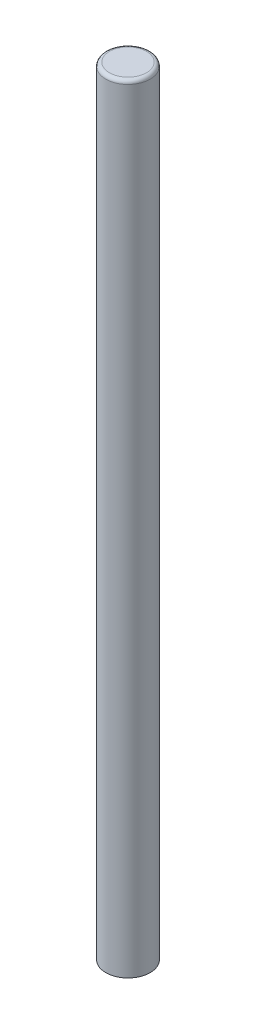
ISO-10303-21;
HEADER;
FILE_DESCRIPTION(('STEP AP214'),'2;1');
FILE_NAME('part.step','',(''),(''),'','','');
FILE_SCHEMA(('AUTOMOTIVE_DESIGN { 1 0 10303 214 1 1 1 1 }'));
ENDSEC;
DATA;
#1=APPLICATION_CONTEXT('core data for automotive mechanical design processes');
#2=APPLICATION_PROTOCOL_DEFINITION('international standard','automotive_design',2000,#1);
#3=PRODUCT_CONTEXT('',#1,'mechanical');
#4=PRODUCT('Part','Part','',(#3));
#5=PRODUCT_RELATED_PRODUCT_CATEGORY('part','',(#4));
#6=PRODUCT_DEFINITION_FORMATION('','',#4);
#7=PRODUCT_DEFINITION_CONTEXT('part definition',#1,'design');
#8=PRODUCT_DEFINITION('design','',#6,#7);
#9=PRODUCT_DEFINITION_SHAPE('','',#8);
#10=(LENGTH_UNIT() NAMED_UNIT(*) SI_UNIT(.MILLI.,.METRE.));
#11=(NAMED_UNIT(*) PLANE_ANGLE_UNIT() SI_UNIT($,.RADIAN.));
#12=(NAMED_UNIT(*) SI_UNIT($,.STERADIAN.) SOLID_ANGLE_UNIT());
#13=UNCERTAINTY_MEASURE_WITH_UNIT(LENGTH_MEASURE(1.E-05),#10,'distance_accuracy_value','');
#14=(GEOMETRIC_REPRESENTATION_CONTEXT(3) GLOBAL_UNCERTAINTY_ASSIGNED_CONTEXT((#13)) GLOBAL_UNIT_ASSIGNED_CONTEXT((#10,
#11,#12)) REPRESENTATION_CONTEXT('',''));
#15=CARTESIAN_POINT('',(0.,0.,0.));
#16=DIRECTION('',(0.,0.,1.));
#17=DIRECTION('',(1.,0.,0.));
#18=AXIS2_PLACEMENT_3D('',#15,#16,#17);
#19=CARTESIAN_POINT('',(0.,105.,0.));
#20=DIRECTION('',(0.,-1.,0.));
#21=DIRECTION('',(0.,0.,-1.));
#22=AXIS2_PLACEMENT_3D('',#19,#20,#21);
#23=CYLINDRICAL_SURFACE('',#22,3.);
#24=CARTESIAN_POINT('',(0.,104.5,0.));
#25=DIRECTION('',(0.,1.,0.));
#26=DIRECTION('',(0.,0.,1.));
#27=AXIS2_PLACEMENT_3D('',#24,#25,#26);
#28=CIRCLE('',#27,3.);
#29=CARTESIAN_POINT('',(0.,104.5,3.));
#30=VERTEX_POINT('',#29);
#31=EDGE_CURVE('E10',#30,#30,#28,.F.);
#32=ORIENTED_EDGE('',*,*,#31,.T.);
#33=EDGE_LOOP('',(#32));
#34=FACE_BOUND('',#33,.T.);
#35=CARTESIAN_POINT('',(0.,0.,0.));
#36=DIRECTION('',(0.,1.,0.));
#37=DIRECTION('',(0.,0.,1.));
#38=AXIS2_PLACEMENT_3D('',#35,#36,#37);
#39=CIRCLE('',#38,3.);
#40=CARTESIAN_POINT('',(0.,0.,3.));
#41=VERTEX_POINT('',#40);
#42=EDGE_CURVE('E42',#41,#41,#39,.T.);
#43=ORIENTED_EDGE('',*,*,#42,.T.);
#44=EDGE_LOOP('',(#43));
#45=FACE_BOUND('',#44,.T.);
#46=ADVANCED_FACE('F31',(#34,#45),#23,.T.);
#47=CARTESIAN_POINT('',(0.,105.,0.));
#48=DIRECTION('',(0.,1.,0.));
#49=DIRECTION('',(0.,0.,1.));
#50=AXIS2_PLACEMENT_3D('',#47,#48,#49);
#51=PLANE('',#50);
#52=CARTESIAN_POINT('',(0.,105.,0.));
#53=DIRECTION('',(0.,1.,0.));
#54=DIRECTION('',(0.,0.,1.));
#55=AXIS2_PLACEMENT_3D('',#52,#53,#54);
#56=CIRCLE('',#55,2.5);
#57=CARTESIAN_POINT('',(0.,105.,2.5));
#58=VERTEX_POINT('',#57);
#59=EDGE_CURVE('E38',#58,#58,#56,.T.);
#60=ORIENTED_EDGE('',*,*,#59,.T.);
#61=EDGE_LOOP('',(#60));
#62=FACE_BOUND('',#61,.T.);
#63=ADVANCED_FACE('F52',(#62),#51,.T.);
#64=CARTESIAN_POINT('',(0.,0.,0.));
#65=DIRECTION('',(0.,1.,0.));
#66=DIRECTION('',(0.,0.,1.));
#67=AXIS2_PLACEMENT_3D('',#64,#65,#66);
#68=PLANE('',#67);
#69=ORIENTED_EDGE('',*,*,#42,.F.);
#70=EDGE_LOOP('',(#69));
#71=FACE_BOUND('',#70,.T.);
#72=ADVANCED_FACE('F50',(#71),#68,.F.);
#73=CARTESIAN_POINT('',(0.,104.5,0.));
#74=DIRECTION('',(0.,1.,0.));
#75=DIRECTION('',(0.,0.,1.));
#76=AXIS2_PLACEMENT_3D('',#73,#74,#75);
#77=TOROIDAL_SURFACE('',#76,2.5,0.5);
#78=ORIENTED_EDGE('',*,*,#31,.F.);
#79=EDGE_LOOP('',(#78));
#80=FACE_BOUND('',#79,.T.);
#81=ORIENTED_EDGE('',*,*,#59,.F.);
#82=EDGE_LOOP('',(#81));
#83=FACE_BOUND('',#82,.T.);
#84=ADVANCED_FACE('F33',(#80,#83),#77,.T.);
#85=CLOSED_SHELL('',(#46,#63,#72,#84));
#86=MANIFOLD_SOLID_BREP('B2',#85);
#87=ADVANCED_BREP_SHAPE_REPRESENTATION('',(#18,#86),#14);
#88=SHAPE_DEFINITION_REPRESENTATION(#9,#87);
ENDSEC;
END-ISO-10303-21;
